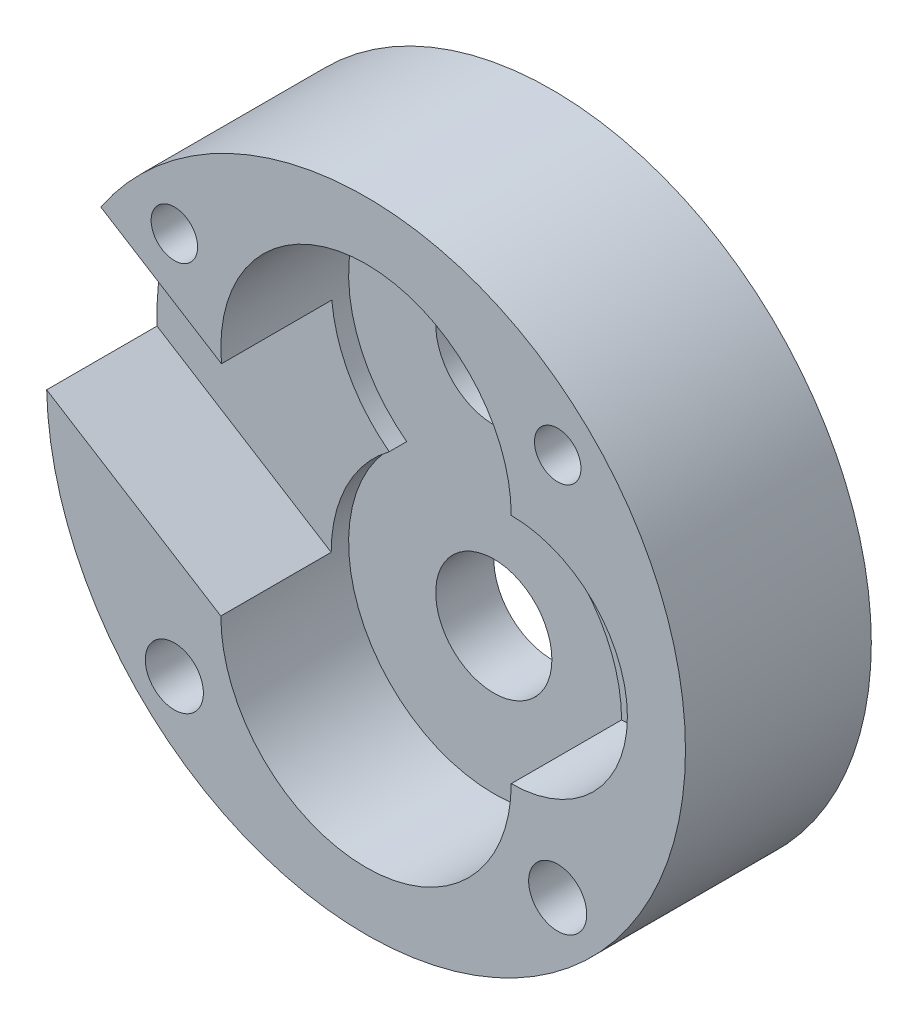
ISO-10303-21;
HEADER;
FILE_DESCRIPTION(('STEP AP214'),'2;1');
FILE_NAME('part.step','',(''),(''),'','','');
FILE_SCHEMA(('AUTOMOTIVE_DESIGN { 1 0 10303 214 1 1 1 1 }'));
ENDSEC;
DATA;
#1=APPLICATION_CONTEXT('core data for automotive mechanical design processes');
#2=APPLICATION_PROTOCOL_DEFINITION('international standard','automotive_design',2000,#1);
#3=PRODUCT_CONTEXT('',#1,'mechanical');
#4=PRODUCT('Part','Part','',(#3));
#5=PRODUCT_RELATED_PRODUCT_CATEGORY('part','',(#4));
#6=PRODUCT_DEFINITION_FORMATION('','',#4);
#7=PRODUCT_DEFINITION_CONTEXT('part definition',#1,'design');
#8=PRODUCT_DEFINITION('design','',#6,#7);
#9=PRODUCT_DEFINITION_SHAPE('','',#8);
#10=(LENGTH_UNIT() NAMED_UNIT(*) SI_UNIT(.MILLI.,.METRE.));
#11=(NAMED_UNIT(*) PLANE_ANGLE_UNIT() SI_UNIT($,.RADIAN.));
#12=(NAMED_UNIT(*) SI_UNIT($,.STERADIAN.) SOLID_ANGLE_UNIT());
#13=UNCERTAINTY_MEASURE_WITH_UNIT(LENGTH_MEASURE(1.E-05),#10,'distance_accuracy_value','');
#14=(GEOMETRIC_REPRESENTATION_CONTEXT(3) GLOBAL_UNCERTAINTY_ASSIGNED_CONTEXT((#13)) GLOBAL_UNIT_ASSIGNED_CONTEXT((#10,
#11,#12)) REPRESENTATION_CONTEXT('',''));
#15=CARTESIAN_POINT('',(0.,0.,0.));
#16=DIRECTION('',(0.,0.,1.));
#17=DIRECTION('',(1.,0.,0.));
#18=AXIS2_PLACEMENT_3D('',#15,#16,#17);
#19=CARTESIAN_POINT('',(0.,20.,-22.));
#20=DIRECTION('',(0.,0.,1.));
#21=DIRECTION('',(1.,0.,0.));
#22=AXIS2_PLACEMENT_3D('',#19,#20,#21);
#23=CYLINDRICAL_SURFACE('',#22,25.);
#24=DIRECTION('',(0.,0.,1.));
#25=VECTOR('',#24,1.);
#26=CARTESIAN_POINT('',(25.,20.,-19.));
#27=LINE('',#26,#25);
#28=CARTESIAN_POINT('',(25.,20.,-19.));
#29=VERTEX_POINT('',#28);
#30=CARTESIAN_POINT('',(25.,20.,0.));
#31=VERTEX_POINT('',#30);
#32=EDGE_CURVE('E100',#29,#31,#27,.T.);
#33=ORIENTED_EDGE('',*,*,#32,.T.);
#34=CARTESIAN_POINT('',(0.,20.,0.));
#35=DIRECTION('',(0.,0.,1.));
#36=DIRECTION('',(1.,0.,0.));
#37=AXIS2_PLACEMENT_3D('',#34,#35,#36);
#38=CIRCLE('',#37,25.);
#39=CARTESIAN_POINT('',(-24.8907586006339,17.6654473051636,0.));
#40=VERTEX_POINT('',#39);
#41=EDGE_CURVE('E143',#31,#40,#38,.T.);
#42=ORIENTED_EDGE('',*,*,#41,.T.);
#43=DIRECTION('',(0.,0.,1.));
#44=VECTOR('',#43,1.);
#45=CARTESIAN_POINT('',(-24.8907586006339,17.6654473051636,-19.));
#46=LINE('',#45,#44);
#47=CARTESIAN_POINT('',(-24.8907586006339,17.6654473051636,-19.));
#48=VERTEX_POINT('',#47);
#49=EDGE_CURVE('E136',#48,#40,#46,.T.);
#50=ORIENTED_EDGE('',*,*,#49,.F.);
#51=CARTESIAN_POINT('',(0.,20.,-19.));
#52=DIRECTION('',(0.,0.,1.));
#53=DIRECTION('',(1.,0.,0.));
#54=AXIS2_PLACEMENT_3D('',#51,#52,#53);
#55=CIRCLE('',#54,25.);
#56=CARTESIAN_POINT('',(-15.,0.,-19.));
#57=VERTEX_POINT('',#56);
#58=EDGE_CURVE('E127',#48,#57,#55,.T.);
#59=ORIENTED_EDGE('',*,*,#58,.T.);
#60=DIRECTION('',(0.,0.,1.));
#61=VECTOR('',#60,1.);
#62=CARTESIAN_POINT('',(-15.,0.,-22.));
#63=LINE('',#62,#61);
#64=CARTESIAN_POINT('',(-15.,0.,-22.));
#65=VERTEX_POINT('',#64);
#66=EDGE_CURVE('E158',#65,#57,#63,.T.);
#67=ORIENTED_EDGE('',*,*,#66,.F.);
#68=CARTESIAN_POINT('',(0.,20.,-22.));
#69=DIRECTION('',(0.,0.,1.));
#70=DIRECTION('',(1.,0.,0.));
#71=AXIS2_PLACEMENT_3D('',#68,#69,#70);
#72=CIRCLE('',#71,25.);
#73=CARTESIAN_POINT('',(15.,0.,-22.));
#74=VERTEX_POINT('',#73);
#75=EDGE_CURVE('E151',#74,#65,#72,.T.);
#76=ORIENTED_EDGE('',*,*,#75,.F.);
#77=DIRECTION('',(0.,0.,1.));
#78=VECTOR('',#77,1.);
#79=CARTESIAN_POINT('',(15.,0.,-22.));
#80=LINE('',#79,#78);
#81=CARTESIAN_POINT('',(15.,0.,-19.));
#82=VERTEX_POINT('',#81);
#83=EDGE_CURVE('E115',#74,#82,#80,.T.);
#84=ORIENTED_EDGE('',*,*,#83,.T.);
#85=CARTESIAN_POINT('',(0.,20.,-19.));
#86=DIRECTION('',(0.,0.,1.));
#87=DIRECTION('',(1.,0.,0.));
#88=AXIS2_PLACEMENT_3D('',#85,#86,#87);
#89=CIRCLE('',#88,25.);
#90=EDGE_CURVE('E49',#82,#29,#89,.T.);
#91=ORIENTED_EDGE('',*,*,#90,.T.);
#92=EDGE_LOOP('',(#33,#42,#50,#59,#67,#76,#84,#91));
#93=FACE_BOUND('',#92,.T.);
#94=ADVANCED_FACE('F32',(#93),#23,.F.);
#95=CARTESIAN_POINT('',(0.,0.,0.));
#96=DIRECTION('',(0.,0.,1.));
#97=DIRECTION('',(1.,0.,0.));
#98=AXIS2_PLACEMENT_3D('',#95,#96,#97);
#99=PLANE('',#98);
#100=CARTESIAN_POINT('',(-33.,-33.,0.));
#101=DIRECTION('',(0.,0.,1.));
#102=DIRECTION('',(1.,0.,0.));
#103=AXIS2_PLACEMENT_3D('',#100,#101,#102);
#104=CIRCLE('',#103,5.);
#105=CARTESIAN_POINT('',(-28.,-33.,0.));
#106=VERTEX_POINT('',#105);
#107=EDGE_CURVE('E173',#106,#106,#104,.T.);
#108=ORIENTED_EDGE('',*,*,#107,.F.);
#109=EDGE_LOOP('',(#108));
#110=FACE_BOUND('',#109,.T.);
#111=CARTESIAN_POINT('',(33.,-33.,0.));
#112=DIRECTION('',(0.,0.,1.));
#113=DIRECTION('',(1.,0.,0.));
#114=AXIS2_PLACEMENT_3D('',#111,#112,#113);
#115=CIRCLE('',#114,5.);
#116=CARTESIAN_POINT('',(38.,-33.,0.));
#117=VERTEX_POINT('',#116);
#118=EDGE_CURVE('E186',#117,#117,#115,.T.);
#119=ORIENTED_EDGE('',*,*,#118,.F.);
#120=EDGE_LOOP('',(#119));
#121=FACE_BOUND('',#120,.T.);
#122=CARTESIAN_POINT('',(33.,33.,0.));
#123=DIRECTION('',(0.,0.,1.));
#124=DIRECTION('',(1.,0.,0.));
#125=AXIS2_PLACEMENT_3D('',#122,#123,#124);
#126=CIRCLE('',#125,4.);
#127=CARTESIAN_POINT('',(37.,33.,0.));
#128=VERTEX_POINT('',#127);
#129=EDGE_CURVE('E192',#128,#128,#126,.T.);
#130=ORIENTED_EDGE('',*,*,#129,.F.);
#131=EDGE_LOOP('',(#130));
#132=FACE_BOUND('',#131,.T.);
#133=CARTESIAN_POINT('',(-33.,33.,0.));
#134=DIRECTION('',(0.,0.,1.));
#135=DIRECTION('',(1.,0.,0.));
#136=AXIS2_PLACEMENT_3D('',#133,#134,#135);
#137=CIRCLE('',#136,4.);
#138=CARTESIAN_POINT('',(-29.,33.,0.));
#139=VERTEX_POINT('',#138);
#140=EDGE_CURVE('E195',#139,#139,#137,.T.);
#141=ORIENTED_EDGE('',*,*,#140,.F.);
#142=EDGE_LOOP('',(#141));
#143=FACE_BOUND('',#142,.T.);
#144=ORIENTED_EDGE('',*,*,#41,.F.);
#145=CARTESIAN_POINT('',(25.,0.,0.));
#146=DIRECTION('',(0.,0.,1.));
#147=DIRECTION('',(1.,0.,0.));
#148=AXIS2_PLACEMENT_3D('',#145,#146,#147);
#149=CIRCLE('',#148,20.);
#150=CARTESIAN_POINT('',(25.,-20.,0.));
#151=VERTEX_POINT('',#150);
#152=EDGE_CURVE('E105',#31,#151,#149,.F.);
#153=ORIENTED_EDGE('',*,*,#152,.T.);
#154=CARTESIAN_POINT('',(0.,-20.,0.));
#155=DIRECTION('',(0.,0.,1.));
#156=DIRECTION('',(1.,0.,0.));
#157=AXIS2_PLACEMENT_3D('',#154,#155,#156);
#158=CIRCLE('',#157,25.);
#159=CARTESIAN_POINT('',(-25.,-20.,0.));
#160=VERTEX_POINT('',#159);
#161=EDGE_CURVE('E155',#160,#151,#158,.T.);
#162=ORIENTED_EDGE('',*,*,#161,.F.);
#163=DIRECTION('',(0.848048096156425,-0.529919264233206,0.));
#164=VECTOR('',#163,1.);
#165=CARTESIAN_POINT('',(-16.0083011281282,-25.6186370466304,0.));
#166=LINE('',#165,#164);
#167=CARTESIAN_POINT('',(-54.9854969660986,-1.2629819441148,0.));
#168=VERTEX_POINT('',#167);
#169=EDGE_CURVE('E128',#168,#160,#166,.T.);
#170=ORIENTED_EDGE('',*,*,#169,.F.);
#171=CARTESIAN_POINT('',(0.,0.,0.));
#172=DIRECTION('',(0.,0.,1.));
#173=DIRECTION('',(1.,0.,0.));
#174=AXIS2_PLACEMENT_3D('',#171,#172,#173);
#175=CIRCLE('',#174,55.);
#176=CARTESIAN_POINT('',(-45.6687921347193,30.6490036535578,0.));
#177=VERTEX_POINT('',#176);
#178=EDGE_CURVE('E41',#168,#177,#175,.T.);
#179=ORIENTED_EDGE('',*,*,#178,.T.);
#180=DIRECTION('',(0.848048096156426,-0.529919264233206,0.));
#181=VECTOR('',#180,1.);
#182=CARTESIAN_POINT('',(0.949115327334362,1.51890203037528,0.));
#183=LINE('',#182,#181);
#184=EDGE_CURVE('E122',#177,#40,#183,.T.);
#185=ORIENTED_EDGE('',*,*,#184,.T.);
#186=EDGE_LOOP('',(#144,#153,#162,#170,#179,#185));
#187=FACE_BOUND('',#186,.T.);
#188=ADVANCED_FACE('F204',(#110,#121,#132,#143,#187),#99,.T.);
#189=CARTESIAN_POINT('',(0.,-20.,-22.));
#190=DIRECTION('',(0.,0.,1.));
#191=DIRECTION('',(1.,0.,0.));
#192=AXIS2_PLACEMENT_3D('',#189,#190,#191);
#193=CYLINDRICAL_SURFACE('',#192,25.);
#194=DIRECTION('',(0.,0.,1.));
#195=VECTOR('',#194,1.);
#196=CARTESIAN_POINT('',(25.,-20.,-19.));
#197=LINE('',#196,#195);
#198=CARTESIAN_POINT('',(25.,-20.,-19.));
#199=VERTEX_POINT('',#198);
#200=EDGE_CURVE('E108',#199,#151,#197,.T.);
#201=ORIENTED_EDGE('',*,*,#200,.F.);
#202=CARTESIAN_POINT('',(0.,-20.,-19.));
#203=DIRECTION('',(0.,0.,1.));
#204=DIRECTION('',(1.,0.,0.));
#205=AXIS2_PLACEMENT_3D('',#202,#203,#204);
#206=CIRCLE('',#205,25.);
#207=EDGE_CURVE('E109',#199,#82,#206,.T.);
#208=ORIENTED_EDGE('',*,*,#207,.T.);
#209=ORIENTED_EDGE('',*,*,#83,.F.);
#210=CARTESIAN_POINT('',(0.,-20.,-22.));
#211=DIRECTION('',(0.,0.,1.));
#212=DIRECTION('',(1.,0.,0.));
#213=AXIS2_PLACEMENT_3D('',#210,#211,#212);
#214=CIRCLE('',#213,25.);
#215=EDGE_CURVE('E154',#65,#74,#214,.T.);
#216=ORIENTED_EDGE('',*,*,#215,.F.);
#217=ORIENTED_EDGE('',*,*,#66,.T.);
#218=CARTESIAN_POINT('',(0.,-20.,-19.));
#219=DIRECTION('',(0.,0.,1.));
#220=DIRECTION('',(1.,0.,0.));
#221=AXIS2_PLACEMENT_3D('',#218,#219,#220);
#222=CIRCLE('',#221,25.);
#223=CARTESIAN_POINT('',(-25.,-20.,-19.));
#224=VERTEX_POINT('',#223);
#225=EDGE_CURVE('E124',#57,#224,#222,.T.);
#226=ORIENTED_EDGE('',*,*,#225,.T.);
#227=DIRECTION('',(0.,0.,1.));
#228=VECTOR('',#227,1.);
#229=CARTESIAN_POINT('',(-25.,-20.,-19.));
#230=LINE('',#229,#228);
#231=EDGE_CURVE('E140',#224,#160,#230,.T.);
#232=ORIENTED_EDGE('',*,*,#231,.T.);
#233=ORIENTED_EDGE('',*,*,#161,.T.);
#234=EDGE_LOOP('',(#201,#208,#209,#216,#217,#226,#232,#233));
#235=FACE_BOUND('',#234,.T.);
#236=ADVANCED_FACE('F207',(#235),#193,.F.);
#237=CARTESIAN_POINT('',(0.,0.,-32.));
#238=DIRECTION('',(0.,0.,1.));
#239=DIRECTION('',(1.,0.,0.));
#240=AXIS2_PLACEMENT_3D('',#237,#238,#239);
#241=CYLINDRICAL_SURFACE('',#240,55.);
#242=DIRECTION('',(0.,0.,1.));
#243=VECTOR('',#242,1.);
#244=CARTESIAN_POINT('',(-54.9854969660986,-1.2629819441148,-19.));
#245=LINE('',#244,#243);
#246=CARTESIAN_POINT('',(-54.9854969660986,-1.2629819441148,-19.));
#247=VERTEX_POINT('',#246);
#248=EDGE_CURVE('E144',#247,#168,#245,.T.);
#249=ORIENTED_EDGE('',*,*,#248,.F.);
#250=CARTESIAN_POINT('',(0.,0.,-19.));
#251=DIRECTION('',(0.,0.,1.));
#252=DIRECTION('',(1.,0.,0.));
#253=AXIS2_PLACEMENT_3D('',#250,#251,#252);
#254=CIRCLE('',#253,55.);
#255=CARTESIAN_POINT('',(-45.6687921347193,30.6490036535578,-19.));
#256=VERTEX_POINT('',#255);
#257=EDGE_CURVE('E133',#256,#247,#254,.T.);
#258=ORIENTED_EDGE('',*,*,#257,.F.);
#259=DIRECTION('',(0.,0.,1.));
#260=VECTOR('',#259,1.);
#261=CARTESIAN_POINT('',(-45.6687921347193,30.6490036535578,-19.));
#262=LINE('',#261,#260);
#263=EDGE_CURVE('E146',#256,#177,#262,.T.);
#264=ORIENTED_EDGE('',*,*,#263,.T.);
#265=ORIENTED_EDGE('',*,*,#178,.F.);
#266=EDGE_LOOP('',(#249,#258,#264,#265));
#267=FACE_BOUND('',#266,.T.);
#268=CARTESIAN_POINT('',(0.,0.,-32.));
#269=DIRECTION('',(0.,0.,1.));
#270=DIRECTION('',(1.,0.,0.));
#271=AXIS2_PLACEMENT_3D('',#268,#269,#270);
#272=CIRCLE('',#271,55.);
#273=CARTESIAN_POINT('',(55.,0.,-32.));
#274=VERTEX_POINT('',#273);
#275=EDGE_CURVE('E11',#274,#274,#272,.T.);
#276=ORIENTED_EDGE('',*,*,#275,.T.);
#277=EDGE_LOOP('',(#276));
#278=FACE_BOUND('',#277,.T.);
#279=ADVANCED_FACE('F34',(#267,#278),#241,.T.);
#280=CARTESIAN_POINT('',(0.,0.,-32.));
#281=DIRECTION('',(0.,0.,1.));
#282=DIRECTION('',(1.,0.,0.));
#283=AXIS2_PLACEMENT_3D('',#280,#281,#282);
#284=PLANE('',#283);
#285=CARTESIAN_POINT('',(0.,20.,-32.));
#286=DIRECTION('',(0.,0.,1.));
#287=DIRECTION('',(1.,0.,0.));
#288=AXIS2_PLACEMENT_3D('',#285,#286,#287);
#289=CIRCLE('',#288,10.);
#290=CARTESIAN_POINT('',(10.,20.,-32.));
#291=VERTEX_POINT('',#290);
#292=EDGE_CURVE('E180',#291,#291,#289,.T.);
#293=ORIENTED_EDGE('',*,*,#292,.T.);
#294=EDGE_LOOP('',(#293));
#295=FACE_BOUND('',#294,.T.);
#296=CARTESIAN_POINT('',(0.,-20.,-32.));
#297=DIRECTION('',(0.,0.,1.));
#298=DIRECTION('',(1.,0.,0.));
#299=AXIS2_PLACEMENT_3D('',#296,#297,#298);
#300=CIRCLE('',#299,10.);
#301=CARTESIAN_POINT('',(10.,-20.,-32.));
#302=VERTEX_POINT('',#301);
#303=EDGE_CURVE('E169',#302,#302,#300,.T.);
#304=ORIENTED_EDGE('',*,*,#303,.T.);
#305=EDGE_LOOP('',(#304));
#306=FACE_BOUND('',#305,.T.);
#307=CARTESIAN_POINT('',(-33.,-33.,-32.));
#308=DIRECTION('',(0.,0.,1.));
#309=DIRECTION('',(1.,0.,0.));
#310=AXIS2_PLACEMENT_3D('',#307,#308,#309);
#311=CIRCLE('',#310,5.);
#312=CARTESIAN_POINT('',(-28.,-33.,-32.));
#313=VERTEX_POINT('',#312);
#314=EDGE_CURVE('E168',#313,#313,#311,.T.);
#315=ORIENTED_EDGE('',*,*,#314,.T.);
#316=EDGE_LOOP('',(#315));
#317=FACE_BOUND('',#316,.T.);
#318=CARTESIAN_POINT('',(33.,-33.,-32.));
#319=DIRECTION('',(0.,0.,1.));
#320=DIRECTION('',(1.,0.,0.));
#321=AXIS2_PLACEMENT_3D('',#318,#319,#320);
#322=CIRCLE('',#321,5.);
#323=CARTESIAN_POINT('',(38.,-33.,-32.));
#324=VERTEX_POINT('',#323);
#325=EDGE_CURVE('E184',#324,#324,#322,.T.);
#326=ORIENTED_EDGE('',*,*,#325,.T.);
#327=EDGE_LOOP('',(#326));
#328=FACE_BOUND('',#327,.T.);
#329=CARTESIAN_POINT('',(33.,33.,-32.));
#330=DIRECTION('',(0.,0.,1.));
#331=DIRECTION('',(1.,0.,0.));
#332=AXIS2_PLACEMENT_3D('',#329,#330,#331);
#333=CIRCLE('',#332,4.);
#334=CARTESIAN_POINT('',(37.,33.,-32.));
#335=VERTEX_POINT('',#334);
#336=EDGE_CURVE('E189',#335,#335,#333,.T.);
#337=ORIENTED_EDGE('',*,*,#336,.T.);
#338=EDGE_LOOP('',(#337));
#339=FACE_BOUND('',#338,.T.);
#340=CARTESIAN_POINT('',(-33.,33.,-32.));
#341=DIRECTION('',(0.,0.,1.));
#342=DIRECTION('',(1.,0.,0.));
#343=AXIS2_PLACEMENT_3D('',#340,#341,#342);
#344=CIRCLE('',#343,4.);
#345=CARTESIAN_POINT('',(-29.,33.,-32.));
#346=VERTEX_POINT('',#345);
#347=EDGE_CURVE('E121',#346,#346,#344,.T.);
#348=ORIENTED_EDGE('',*,*,#347,.T.);
#349=EDGE_LOOP('',(#348));
#350=FACE_BOUND('',#349,.T.);
#351=ORIENTED_EDGE('',*,*,#275,.F.);
#352=EDGE_LOOP('',(#351));
#353=FACE_BOUND('',#352,.T.);
#354=ADVANCED_FACE('F223',(#295,#306,#317,#328,#339,#350,#353),#284,.F.);
#355=CARTESIAN_POINT('',(0.,0.,-22.));
#356=DIRECTION('',(0.,0.,1.));
#357=DIRECTION('',(1.,0.,0.));
#358=AXIS2_PLACEMENT_3D('',#355,#356,#357);
#359=PLANE('',#358);
#360=CARTESIAN_POINT('',(0.,20.,-22.));
#361=DIRECTION('',(0.,0.,1.));
#362=DIRECTION('',(1.,0.,0.));
#363=AXIS2_PLACEMENT_3D('',#360,#361,#362);
#364=CIRCLE('',#363,10.);
#365=CARTESIAN_POINT('',(10.,20.,-22.));
#366=VERTEX_POINT('',#365);
#367=EDGE_CURVE('E36',#366,#366,#364,.T.);
#368=ORIENTED_EDGE('',*,*,#367,.F.);
#369=EDGE_LOOP('',(#368));
#370=FACE_BOUND('',#369,.T.);
#371=CARTESIAN_POINT('',(0.,-20.,-22.));
#372=DIRECTION('',(0.,0.,1.));
#373=DIRECTION('',(1.,0.,0.));
#374=AXIS2_PLACEMENT_3D('',#371,#372,#373);
#375=CIRCLE('',#374,10.);
#376=CARTESIAN_POINT('',(10.,-20.,-22.));
#377=VERTEX_POINT('',#376);
#378=EDGE_CURVE('E166',#377,#377,#375,.T.);
#379=ORIENTED_EDGE('',*,*,#378,.F.);
#380=EDGE_LOOP('',(#379));
#381=FACE_BOUND('',#380,.T.);
#382=ORIENTED_EDGE('',*,*,#75,.T.);
#383=ORIENTED_EDGE('',*,*,#215,.T.);
#384=EDGE_LOOP('',(#382,#383));
#385=FACE_BOUND('',#384,.T.);
#386=ADVANCED_FACE('F220',(#370,#381,#385),#359,.T.);
#387=CARTESIAN_POINT('',(-16.0083011281282,-25.6186370466304,-19.));
#388=DIRECTION('',(-0.529919264233206,-0.848048096156425,0.));
#389=DIRECTION('',(0.848048096156425,-0.529919264233206,0.));
#390=AXIS2_PLACEMENT_3D('',#387,#388,#389);
#391=PLANE('',#390);
#392=ORIENTED_EDGE('',*,*,#169,.T.);
#393=ORIENTED_EDGE('',*,*,#231,.F.);
#394=DIRECTION('',(0.848048096156425,-0.529919264233206,0.));
#395=VECTOR('',#394,1.);
#396=CARTESIAN_POINT('',(-16.0083011281282,-25.6186370466304,-19.));
#397=LINE('',#396,#395);
#398=EDGE_CURVE('E57',#247,#224,#397,.T.);
#399=ORIENTED_EDGE('',*,*,#398,.F.);
#400=ORIENTED_EDGE('',*,*,#248,.T.);
#401=EDGE_LOOP('',(#392,#393,#399,#400));
#402=FACE_BOUND('',#401,.T.);
#403=ADVANCED_FACE('F222',(#402),#391,.F.);
#404=CARTESIAN_POINT('',(0.949115327334362,1.51890203037528,-19.));
#405=DIRECTION('',(-0.529919264233206,-0.848048096156426,0.));
#406=DIRECTION('',(0.848048096156426,-0.529919264233206,0.));
#407=AXIS2_PLACEMENT_3D('',#404,#405,#406);
#408=PLANE('',#407);
#409=ORIENTED_EDGE('',*,*,#184,.F.);
#410=ORIENTED_EDGE('',*,*,#263,.F.);
#411=DIRECTION('',(0.848048096156426,-0.529919264233206,0.));
#412=VECTOR('',#411,1.);
#413=CARTESIAN_POINT('',(0.949115327334362,1.51890203037528,-19.));
#414=LINE('',#413,#412);
#415=EDGE_CURVE('E131',#256,#48,#414,.T.);
#416=ORIENTED_EDGE('',*,*,#415,.T.);
#417=ORIENTED_EDGE('',*,*,#49,.T.);
#418=EDGE_LOOP('',(#409,#410,#416,#417));
#419=FACE_BOUND('',#418,.T.);
#420=ADVANCED_FACE('F212',(#419),#408,.T.);
#421=CARTESIAN_POINT('',(0.,0.,-19.));
#422=DIRECTION('',(0.,0.,1.));
#423=DIRECTION('',(1.,0.,0.));
#424=AXIS2_PLACEMENT_3D('',#421,#422,#423);
#425=PLANE('',#424);
#426=ORIENTED_EDGE('',*,*,#225,.F.);
#427=ORIENTED_EDGE('',*,*,#58,.F.);
#428=ORIENTED_EDGE('',*,*,#415,.F.);
#429=ORIENTED_EDGE('',*,*,#257,.T.);
#430=ORIENTED_EDGE('',*,*,#398,.T.);
#431=EDGE_LOOP('',(#426,#427,#428,#429,#430));
#432=FACE_BOUND('',#431,.T.);
#433=ADVANCED_FACE('F216',(#432),#425,.T.);
#434=CARTESIAN_POINT('',(25.,0.,-19.));
#435=DIRECTION('',(0.,0.,1.));
#436=DIRECTION('',(1.,0.,0.));
#437=AXIS2_PLACEMENT_3D('',#434,#435,#436);
#438=CYLINDRICAL_SURFACE('',#437,20.);
#439=ORIENTED_EDGE('',*,*,#152,.F.);
#440=ORIENTED_EDGE('',*,*,#32,.F.);
#441=CARTESIAN_POINT('',(25.,0.,-19.));
#442=DIRECTION('',(0.,0.,1.));
#443=DIRECTION('',(1.,0.,0.));
#444=AXIS2_PLACEMENT_3D('',#441,#442,#443);
#445=CIRCLE('',#444,20.);
#446=EDGE_CURVE('E102',#29,#199,#445,.F.);
#447=ORIENTED_EDGE('',*,*,#446,.T.);
#448=ORIENTED_EDGE('',*,*,#200,.T.);
#449=EDGE_LOOP('',(#439,#440,#447,#448));
#450=FACE_BOUND('',#449,.T.);
#451=ADVANCED_FACE('F101',(#450),#438,.F.);
#452=CARTESIAN_POINT('',(0.,0.,-19.));
#453=DIRECTION('',(0.,0.,1.));
#454=DIRECTION('',(1.,0.,0.));
#455=AXIS2_PLACEMENT_3D('',#452,#453,#454);
#456=PLANE('',#455);
#457=ORIENTED_EDGE('',*,*,#446,.F.);
#458=ORIENTED_EDGE('',*,*,#90,.F.);
#459=ORIENTED_EDGE('',*,*,#207,.F.);
#460=EDGE_LOOP('',(#457,#458,#459));
#461=FACE_BOUND('',#460,.T.);
#462=ADVANCED_FACE('F111',(#461),#456,.T.);
#463=CARTESIAN_POINT('',(-33.,33.,-32.));
#464=DIRECTION('',(0.,0.,1.));
#465=DIRECTION('',(1.,0.,0.));
#466=AXIS2_PLACEMENT_3D('',#463,#464,#465);
#467=CYLINDRICAL_SURFACE('',#466,4.);
#468=ORIENTED_EDGE('',*,*,#347,.F.);
#469=EDGE_LOOP('',(#468));
#470=FACE_BOUND('',#469,.T.);
#471=ORIENTED_EDGE('',*,*,#140,.T.);
#472=EDGE_LOOP('',(#471));
#473=FACE_BOUND('',#472,.T.);
#474=ADVANCED_FACE('F202',(#470,#473),#467,.F.);
#475=CARTESIAN_POINT('',(33.,33.,-32.));
#476=DIRECTION('',(0.,0.,1.));
#477=DIRECTION('',(1.,0.,0.));
#478=AXIS2_PLACEMENT_3D('',#475,#476,#477);
#479=CYLINDRICAL_SURFACE('',#478,4.);
#480=ORIENTED_EDGE('',*,*,#336,.F.);
#481=EDGE_LOOP('',(#480));
#482=FACE_BOUND('',#481,.T.);
#483=ORIENTED_EDGE('',*,*,#129,.T.);
#484=EDGE_LOOP('',(#483));
#485=FACE_BOUND('',#484,.T.);
#486=ADVANCED_FACE('F278',(#482,#485),#479,.F.);
#487=CARTESIAN_POINT('',(33.,-33.,-32.));
#488=DIRECTION('',(0.,0.,1.));
#489=DIRECTION('',(1.,0.,0.));
#490=AXIS2_PLACEMENT_3D('',#487,#488,#489);
#491=CYLINDRICAL_SURFACE('',#490,5.);
#492=ORIENTED_EDGE('',*,*,#325,.F.);
#493=EDGE_LOOP('',(#492));
#494=FACE_BOUND('',#493,.T.);
#495=ORIENTED_EDGE('',*,*,#118,.T.);
#496=EDGE_LOOP('',(#495));
#497=FACE_BOUND('',#496,.T.);
#498=ADVANCED_FACE('F290',(#494,#497),#491,.F.);
#499=CARTESIAN_POINT('',(-33.,-33.,-32.));
#500=DIRECTION('',(0.,0.,1.));
#501=DIRECTION('',(1.,0.,0.));
#502=AXIS2_PLACEMENT_3D('',#499,#500,#501);
#503=CYLINDRICAL_SURFACE('',#502,5.);
#504=ORIENTED_EDGE('',*,*,#314,.F.);
#505=EDGE_LOOP('',(#504));
#506=FACE_BOUND('',#505,.T.);
#507=ORIENTED_EDGE('',*,*,#107,.T.);
#508=EDGE_LOOP('',(#507));
#509=FACE_BOUND('',#508,.T.);
#510=ADVANCED_FACE('F300',(#506,#509),#503,.F.);
#511=CARTESIAN_POINT('',(0.,-20.,-32.));
#512=DIRECTION('',(0.,0.,1.));
#513=DIRECTION('',(1.,0.,0.));
#514=AXIS2_PLACEMENT_3D('',#511,#512,#513);
#515=CYLINDRICAL_SURFACE('',#514,10.);
#516=ORIENTED_EDGE('',*,*,#378,.T.);
#517=EDGE_LOOP('',(#516));
#518=FACE_BOUND('',#517,.T.);
#519=ORIENTED_EDGE('',*,*,#303,.F.);
#520=EDGE_LOOP('',(#519));
#521=FACE_BOUND('',#520,.T.);
#522=ADVANCED_FACE('F310',(#518,#521),#515,.F.);
#523=CARTESIAN_POINT('',(0.,20.,-32.));
#524=DIRECTION('',(0.,0.,1.));
#525=DIRECTION('',(1.,0.,0.));
#526=AXIS2_PLACEMENT_3D('',#523,#524,#525);
#527=CYLINDRICAL_SURFACE('',#526,10.);
#528=ORIENTED_EDGE('',*,*,#367,.T.);
#529=EDGE_LOOP('',(#528));
#530=FACE_BOUND('',#529,.T.);
#531=ORIENTED_EDGE('',*,*,#292,.F.);
#532=EDGE_LOOP('',(#531));
#533=FACE_BOUND('',#532,.T.);
#534=ADVANCED_FACE('F320',(#530,#533),#527,.F.);
#535=CLOSED_SHELL('',(#94,#188,#236,#279,#354,#386,#403,#420,#433,#451,#462,#474,#486,#498,#510,
#522,#534));
#536=MANIFOLD_SOLID_BREP('B2',#535);
#537=ADVANCED_BREP_SHAPE_REPRESENTATION('',(#18,#536),#14);
#538=SHAPE_DEFINITION_REPRESENTATION(#9,#537);
ENDSEC;
END-ISO-10303-21;
